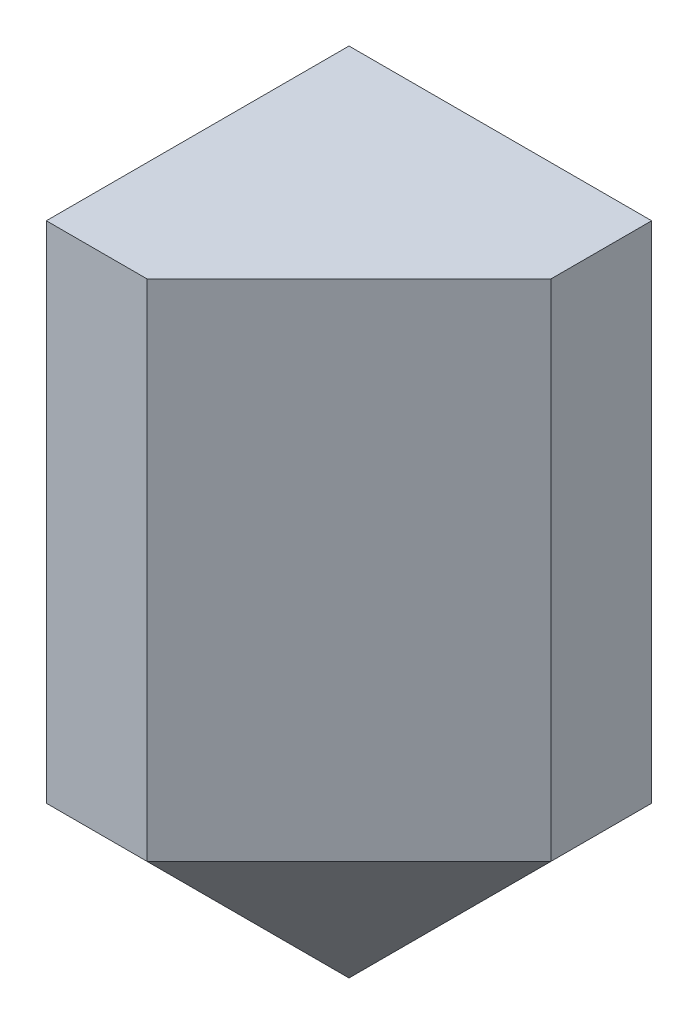
ISO-10303-21;
HEADER;
FILE_DESCRIPTION(('STEP AP214'),'2;1');
FILE_NAME('part.step','',(''),(''),'','','');
FILE_SCHEMA(('AUTOMOTIVE_DESIGN { 1 0 10303 214 1 1 1 1 }'));
ENDSEC;
DATA;
#1=APPLICATION_CONTEXT('core data for automotive mechanical design processes');
#2=APPLICATION_PROTOCOL_DEFINITION('international standard','automotive_design',2000,#1);
#3=PRODUCT_CONTEXT('',#1,'mechanical');
#4=PRODUCT('Part','Part','',(#3));
#5=PRODUCT_RELATED_PRODUCT_CATEGORY('part','',(#4));
#6=PRODUCT_DEFINITION_FORMATION('','',#4);
#7=PRODUCT_DEFINITION_CONTEXT('part definition',#1,'design');
#8=PRODUCT_DEFINITION('design','',#6,#7);
#9=PRODUCT_DEFINITION_SHAPE('','',#8);
#10=(LENGTH_UNIT() NAMED_UNIT(*) SI_UNIT(.MILLI.,.METRE.));
#11=(NAMED_UNIT(*) PLANE_ANGLE_UNIT() SI_UNIT($,.RADIAN.));
#12=(NAMED_UNIT(*) SI_UNIT($,.STERADIAN.) SOLID_ANGLE_UNIT());
#13=UNCERTAINTY_MEASURE_WITH_UNIT(LENGTH_MEASURE(1.E-05),#10,'distance_accuracy_value','');
#14=(GEOMETRIC_REPRESENTATION_CONTEXT(3) GLOBAL_UNCERTAINTY_ASSIGNED_CONTEXT((#13)) GLOBAL_UNIT_ASSIGNED_CONTEXT((#10,
#11,#12)) REPRESENTATION_CONTEXT('',''));
#15=CARTESIAN_POINT('',(0.,0.,0.));
#16=DIRECTION('',(0.,0.,1.));
#17=DIRECTION('',(1.,0.,0.));
#18=AXIS2_PLACEMENT_3D('',#15,#16,#17);
#19=CARTESIAN_POINT('',(0.,0.,30.));
#20=DIRECTION('',(1.,0.,0.));
#21=DIRECTION('',(0.,0.,-1.));
#22=AXIS2_PLACEMENT_3D('',#19,#20,#21);
#23=PLANE('',#22);
#24=CARTESIAN_POINT('',(0.,20.,18.));
#25=DIRECTION('',(-1.,0.,0.));
#26=DIRECTION('',(0.,0.,1.));
#27=AXIS2_PLACEMENT_3D('',#24,#25,#26);
#28=CIRCLE('',#27,2.75);
#29=CARTESIAN_POINT('',(0.,20.,20.75));
#30=VERTEX_POINT('',#29);
#31=EDGE_CURVE('E112',#30,#30,#28,.T.);
#32=ORIENTED_EDGE('',*,*,#31,.F.);
#33=EDGE_LOOP('',(#32));
#34=FACE_BOUND('',#33,.T.);
#35=CARTESIAN_POINT('',(0.,48.,18.));
#36=DIRECTION('',(-1.,0.,0.));
#37=DIRECTION('',(0.,0.,1.));
#38=AXIS2_PLACEMENT_3D('',#35,#36,#37);
#39=CIRCLE('',#38,2.75);
#40=CARTESIAN_POINT('',(0.,48.,20.75));
#41=VERTEX_POINT('',#40);
#42=EDGE_CURVE('E125',#41,#41,#39,.T.);
#43=ORIENTED_EDGE('',*,*,#42,.F.);
#44=EDGE_LOOP('',(#43));
#45=FACE_BOUND('',#44,.T.);
#46=DIRECTION('',(0.,0.,-1.));
#47=VECTOR('',#46,1.);
#48=CARTESIAN_POINT('',(0.,0.,30.));
#49=LINE('',#48,#47);
#50=CARTESIAN_POINT('',(0.,0.,9.99999999999995));
#51=VERTEX_POINT('',#50);
#52=CARTESIAN_POINT('',(0.,0.,0.));
#53=VERTEX_POINT('',#52);
#54=EDGE_CURVE('E150',#51,#53,#49,.T.);
#55=ORIENTED_EDGE('',*,*,#54,.F.);
#56=DIRECTION('',(0.,-0.707106781186546,-0.707106781186549));
#57=VECTOR('',#56,1.);
#58=CARTESIAN_POINT('',(0.,20.,30.));
#59=LINE('',#58,#57);
#60=CARTESIAN_POINT('',(0.,20.,30.));
#61=VERTEX_POINT('',#60);
#62=EDGE_CURVE('E11',#51,#61,#59,.F.);
#63=ORIENTED_EDGE('',*,*,#62,.T.);
#64=DIRECTION('',(0.,-1.,0.));
#65=VECTOR('',#64,1.);
#66=CARTESIAN_POINT('',(0.,0.,30.));
#67=LINE('',#66,#65);
#68=CARTESIAN_POINT('',(0.,70.,30.));
#69=VERTEX_POINT('',#68);
#70=EDGE_CURVE('E147',#69,#61,#67,.T.);
#71=ORIENTED_EDGE('',*,*,#70,.F.);
#72=DIRECTION('',(0.,0.,1.));
#73=VECTOR('',#72,1.);
#74=CARTESIAN_POINT('',(0.,70.,30.));
#75=LINE('',#74,#73);
#76=CARTESIAN_POINT('',(0.,70.,0.));
#77=VERTEX_POINT('',#76);
#78=EDGE_CURVE('E131',#77,#69,#75,.T.);
#79=ORIENTED_EDGE('',*,*,#78,.F.);
#80=DIRECTION('',(0.,-1.,0.));
#81=VECTOR('',#80,1.);
#82=CARTESIAN_POINT('',(0.,0.,0.));
#83=LINE('',#82,#81);
#84=EDGE_CURVE('E152',#77,#53,#83,.T.);
#85=ORIENTED_EDGE('',*,*,#84,.T.);
#86=EDGE_LOOP('',(#55,#63,#71,#79,#85));
#87=FACE_BOUND('',#86,.T.);
#88=ADVANCED_FACE('F39',(#34,#45,#87),#23,.F.);
#89=CARTESIAN_POINT('',(0.,0.,30.));
#90=DIRECTION('',(0.,1.,0.));
#91=DIRECTION('',(0.,0.,1.));
#92=AXIS2_PLACEMENT_3D('',#89,#90,#91);
#93=PLANE('',#92);
#94=DIRECTION('',(1.,0.,0.));
#95=VECTOR('',#94,1.);
#96=CARTESIAN_POINT('',(0.,0.,0.));
#97=LINE('',#96,#95);
#98=CARTESIAN_POINT('',(9.99999999999995,0.,0.));
#99=VERTEX_POINT('',#98);
#100=EDGE_CURVE('E155',#53,#99,#97,.T.);
#101=ORIENTED_EDGE('',*,*,#100,.T.);
#102=DIRECTION('',(0.,0.,1.));
#103=VECTOR('',#102,1.);
#104=CARTESIAN_POINT('',(9.99999999999995,0.,30.));
#105=LINE('',#104,#103);
#106=CARTESIAN_POINT('',(9.99999999999995,0.,9.99999999999995));
#107=VERTEX_POINT('',#106);
#108=EDGE_CURVE('E49',#99,#107,#105,.T.);
#109=ORIENTED_EDGE('',*,*,#108,.T.);
#110=DIRECTION('',(-1.,0.,0.));
#111=VECTOR('',#110,1.);
#112=CARTESIAN_POINT('',(0.,0.,9.99999999999995));
#113=LINE('',#112,#111);
#114=EDGE_CURVE('E60',#107,#51,#113,.T.);
#115=ORIENTED_EDGE('',*,*,#114,.T.);
#116=ORIENTED_EDGE('',*,*,#54,.T.);
#117=EDGE_LOOP('',(#101,#109,#115,#116));
#118=FACE_BOUND('',#117,.T.);
#119=ADVANCED_FACE('F208',(#118),#93,.F.);
#120=CARTESIAN_POINT('',(30.,0.,30.));
#121=DIRECTION('',(-1.,0.,0.));
#122=DIRECTION('',(0.,0.,1.));
#123=AXIS2_PLACEMENT_3D('',#120,#121,#122);
#124=PLANE('',#123);
#125=DIRECTION('',(0.,1.,0.));
#126=VECTOR('',#125,1.);
#127=CARTESIAN_POINT('',(30.,0.,0.));
#128=LINE('',#127,#126);
#129=CARTESIAN_POINT('',(30.,20.,0.));
#130=VERTEX_POINT('',#129);
#131=CARTESIAN_POINT('',(30.,70.,0.));
#132=VERTEX_POINT('',#131);
#133=EDGE_CURVE('E151',#130,#132,#128,.T.);
#134=ORIENTED_EDGE('',*,*,#133,.T.);
#135=DIRECTION('',(0.,0.,-1.));
#136=VECTOR('',#135,1.);
#137=CARTESIAN_POINT('',(30.,70.,0.));
#138=LINE('',#137,#136);
#139=CARTESIAN_POINT('',(30.,70.,9.99999999999992));
#140=VERTEX_POINT('',#139);
#141=EDGE_CURVE('E140',#140,#132,#138,.T.);
#142=ORIENTED_EDGE('',*,*,#141,.F.);
#143=DIRECTION('',(0.,-1.,0.));
#144=VECTOR('',#143,1.);
#145=CARTESIAN_POINT('',(30.,0.,9.99999999999995));
#146=LINE('',#145,#144);
#147=CARTESIAN_POINT('',(30.,20.,9.99999999999995));
#148=VERTEX_POINT('',#147);
#149=EDGE_CURVE('E165',#140,#148,#146,.T.);
#150=ORIENTED_EDGE('',*,*,#149,.T.);
#151=DIRECTION('',(0.,0.,-1.));
#152=VECTOR('',#151,1.);
#153=CARTESIAN_POINT('',(30.,20.,30.));
#154=LINE('',#153,#152);
#155=EDGE_CURVE('E163',#148,#130,#154,.T.);
#156=ORIENTED_EDGE('',*,*,#155,.T.);
#157=EDGE_LOOP('',(#134,#142,#150,#156));
#158=FACE_BOUND('',#157,.T.);
#159=ADVANCED_FACE('F214',(#158),#124,.F.);
#160=CARTESIAN_POINT('',(0.,0.,30.));
#161=DIRECTION('',(0.,0.,-1.));
#162=DIRECTION('',(-1.,0.,0.));
#163=AXIS2_PLACEMENT_3D('',#160,#161,#162);
#164=PLANE('',#163);
#165=DIRECTION('',(1.,0.,0.));
#166=VECTOR('',#165,1.);
#167=CARTESIAN_POINT('',(0.,20.,30.));
#168=LINE('',#167,#166);
#169=CARTESIAN_POINT('',(10.,20.,30.));
#170=VERTEX_POINT('',#169);
#171=EDGE_CURVE('E159',#61,#170,#168,.T.);
#172=ORIENTED_EDGE('',*,*,#171,.T.);
#173=DIRECTION('',(0.,1.,0.));
#174=VECTOR('',#173,1.);
#175=CARTESIAN_POINT('',(10.,0.,30.));
#176=LINE('',#175,#174);
#177=CARTESIAN_POINT('',(9.99999999999999,70.,30.));
#178=VERTEX_POINT('',#177);
#179=EDGE_CURVE('E161',#170,#178,#176,.T.);
#180=ORIENTED_EDGE('',*,*,#179,.T.);
#181=DIRECTION('',(1.,0.,0.));
#182=VECTOR('',#181,1.);
#183=CARTESIAN_POINT('',(9.99999999999999,70.,30.));
#184=LINE('',#183,#182);
#185=EDGE_CURVE('E134',#69,#178,#184,.T.);
#186=ORIENTED_EDGE('',*,*,#185,.F.);
#187=ORIENTED_EDGE('',*,*,#70,.T.);
#188=EDGE_LOOP('',(#172,#180,#186,#187));
#189=FACE_BOUND('',#188,.T.);
#190=ADVANCED_FACE('F188',(#189),#164,.F.);
#191=CARTESIAN_POINT('',(0.,0.,0.));
#192=DIRECTION('',(0.,0.,-1.));
#193=DIRECTION('',(-1.,0.,0.));
#194=AXIS2_PLACEMENT_3D('',#191,#192,#193);
#195=PLANE('',#194);
#196=CARTESIAN_POINT('',(15.,55.,0.));
#197=DIRECTION('',(0.,0.,-1.));
#198=DIRECTION('',(-1.,0.,0.));
#199=AXIS2_PLACEMENT_3D('',#196,#197,#198);
#200=CIRCLE('',#199,10.);
#201=CARTESIAN_POINT('',(5.,55.,0.));
#202=VERTEX_POINT('',#201);
#203=EDGE_CURVE('E425',#202,#202,#200,.T.);
#204=ORIENTED_EDGE('',*,*,#203,.F.);
#205=EDGE_LOOP('',(#204));
#206=FACE_BOUND('',#205,.T.);
#207=CARTESIAN_POINT('',(18.,20.,0.));
#208=DIRECTION('',(0.,0.,-1.));
#209=DIRECTION('',(-1.,0.,0.));
#210=AXIS2_PLACEMENT_3D('',#207,#208,#209);
#211=CIRCLE('',#210,2.74999999999999);
#212=CARTESIAN_POINT('',(15.25,20.,0.));
#213=VERTEX_POINT('',#212);
#214=EDGE_CURVE('E113',#213,#213,#211,.T.);
#215=ORIENTED_EDGE('',*,*,#214,.F.);
#216=EDGE_LOOP('',(#215));
#217=FACE_BOUND('',#216,.T.);
#218=ORIENTED_EDGE('',*,*,#133,.F.);
#219=DIRECTION('',(0.707106781186549,0.707106781186546,0.));
#220=VECTOR('',#219,1.);
#221=CARTESIAN_POINT('',(4.99999999999996,-4.99999999999997,0.));
#222=LINE('',#221,#220);
#223=EDGE_CURVE('E167',#130,#99,#222,.F.);
#224=ORIENTED_EDGE('',*,*,#223,.T.);
#225=ORIENTED_EDGE('',*,*,#100,.F.);
#226=ORIENTED_EDGE('',*,*,#84,.F.);
#227=DIRECTION('',(-1.,0.,0.));
#228=VECTOR('',#227,1.);
#229=CARTESIAN_POINT('',(0.,70.,0.));
#230=LINE('',#229,#228);
#231=EDGE_CURVE('E143',#132,#77,#230,.T.);
#232=ORIENTED_EDGE('',*,*,#231,.F.);
#233=EDGE_LOOP('',(#218,#224,#225,#226,#232));
#234=FACE_BOUND('',#233,.T.);
#235=ADVANCED_FACE('F205',(#206,#217,#234),#195,.T.);
#236=CARTESIAN_POINT('',(30.,20.,30.));
#237=DIRECTION('',(-0.707106781186546,0.707106781186549,0.));
#238=DIRECTION('',(0.,0.,-1.));
#239=AXIS2_PLACEMENT_3D('',#236,#237,#238);
#240=PLANE('',#239);
#241=ORIENTED_EDGE('',*,*,#223,.F.);
#242=ORIENTED_EDGE('',*,*,#155,.F.);
#243=DIRECTION('',(-0.707106781186549,-0.707106781186546,0.));
#244=VECTOR('',#243,1.);
#245=CARTESIAN_POINT('',(30.,20.,9.99999999999995));
#246=LINE('',#245,#244);
#247=EDGE_CURVE('E44',#107,#148,#246,.F.);
#248=ORIENTED_EDGE('',*,*,#247,.F.);
#249=ORIENTED_EDGE('',*,*,#108,.F.);
#250=EDGE_LOOP('',(#241,#242,#248,#249));
#251=FACE_BOUND('',#250,.T.);
#252=ADVANCED_FACE('F42',(#251),#240,.F.);
#253=CARTESIAN_POINT('',(0.,20.,30.));
#254=DIRECTION('',(0.,0.707106781186549,-0.707106781186546));
#255=DIRECTION('',(1.,0.,0.));
#256=AXIS2_PLACEMENT_3D('',#253,#254,#255);
#257=PLANE('',#256);
#258=ORIENTED_EDGE('',*,*,#62,.F.);
#259=ORIENTED_EDGE('',*,*,#114,.F.);
#260=DIRECTION('',(0.,0.707106781186546,0.707106781186549));
#261=VECTOR('',#260,1.);
#262=CARTESIAN_POINT('',(9.99999999999998,10.,20.));
#263=LINE('',#262,#261);
#264=EDGE_CURVE('E172',#170,#107,#263,.F.);
#265=ORIENTED_EDGE('',*,*,#264,.F.);
#266=ORIENTED_EDGE('',*,*,#171,.F.);
#267=EDGE_LOOP('',(#258,#259,#265,#266));
#268=FACE_BOUND('',#267,.T.);
#269=ADVANCED_FACE('F198',(#268),#257,.F.);
#270=CARTESIAN_POINT('',(30.,20.,9.99999999999995));
#271=DIRECTION('',(0.577350269189626,-0.577350269189628,0.577350269189624));
#272=DIRECTION('',(0.707106781186549,0.707106781186546,0.));
#273=AXIS2_PLACEMENT_3D('',#270,#271,#272);
#274=PLANE('',#273);
#275=ORIENTED_EDGE('',*,*,#264,.T.);
#276=ORIENTED_EDGE('',*,*,#247,.T.);
#277=DIRECTION('',(0.707106781186546,0.,-0.707106781186549));
#278=VECTOR('',#277,1.);
#279=CARTESIAN_POINT('',(30.,20.,9.99999999999995));
#280=LINE('',#279,#278);
#281=EDGE_CURVE('E146',#170,#148,#280,.T.);
#282=ORIENTED_EDGE('',*,*,#281,.F.);
#283=EDGE_LOOP('',(#275,#276,#282));
#284=FACE_BOUND('',#283,.T.);
#285=ADVANCED_FACE('F179',(#284),#274,.T.);
#286=CARTESIAN_POINT('',(10.,0.,30.));
#287=DIRECTION('',(-0.707106781186549,0.,-0.707106781186546));
#288=DIRECTION('',(0.,1.,0.));
#289=AXIS2_PLACEMENT_3D('',#286,#287,#288);
#290=PLANE('',#289);
#291=ORIENTED_EDGE('',*,*,#281,.T.);
#292=ORIENTED_EDGE('',*,*,#149,.F.);
#293=DIRECTION('',(0.707106781186546,0.,-0.707106781186549));
#294=VECTOR('',#293,1.);
#295=CARTESIAN_POINT('',(30.,70.,9.99999999999992));
#296=LINE('',#295,#294);
#297=EDGE_CURVE('E137',#178,#140,#296,.T.);
#298=ORIENTED_EDGE('',*,*,#297,.F.);
#299=ORIENTED_EDGE('',*,*,#179,.F.);
#300=EDGE_LOOP('',(#291,#292,#298,#299));
#301=FACE_BOUND('',#300,.T.);
#302=ADVANCED_FACE('F184',(#301),#290,.F.);
#303=CARTESIAN_POINT('',(0.,70.,0.));
#304=DIRECTION('',(0.,-1.,0.));
#305=DIRECTION('',(0.,0.,-1.));
#306=AXIS2_PLACEMENT_3D('',#303,#304,#305);
#307=PLANE('',#306);
#308=ORIENTED_EDGE('',*,*,#78,.T.);
#309=ORIENTED_EDGE('',*,*,#185,.T.);
#310=ORIENTED_EDGE('',*,*,#297,.T.);
#311=ORIENTED_EDGE('',*,*,#141,.T.);
#312=ORIENTED_EDGE('',*,*,#231,.T.);
#313=EDGE_LOOP('',(#308,#309,#310,#311,#312));
#314=FACE_BOUND('',#313,.T.);
#315=ADVANCED_FACE('F191',(#314),#307,.F.);
#316=CARTESIAN_POINT('',(15.,48.,18.));
#317=DIRECTION('',(-1.,0.,0.));
#318=DIRECTION('',(0.,0.,1.));
#319=AXIS2_PLACEMENT_3D('',#316,#317,#318);
#320=CONICAL_SURFACE('',#319,2.75,1.02974425867665);
#321=CARTESIAN_POINT('',(16.6523667023258,48.,18.));
#322=VERTEX_POINT('',#321);
#323=VERTEX_LOOP('',#322);
#324=FACE_BOUND('',#323,.T.);
#325=CARTESIAN_POINT('',(15.,48.,18.));
#326=DIRECTION('',(-1.,0.,0.));
#327=DIRECTION('',(0.,0.,1.));
#328=AXIS2_PLACEMENT_3D('',#325,#326,#327);
#329=CIRCLE('',#328,2.75);
#330=CARTESIAN_POINT('',(15.,48.,20.75));
#331=VERTEX_POINT('',#330);
#332=EDGE_CURVE('E128',#331,#331,#329,.T.);
#333=ORIENTED_EDGE('',*,*,#332,.T.);
#334=EDGE_LOOP('',(#333));
#335=FACE_BOUND('',#334,.T.);
#336=ADVANCED_FACE('F234',(#324,#335),#320,.F.);
#337=CARTESIAN_POINT('',(0.,48.,18.));
#338=DIRECTION('',(-1.,0.,0.));
#339=DIRECTION('',(0.,0.,1.));
#340=AXIS2_PLACEMENT_3D('',#337,#338,#339);
#341=CYLINDRICAL_SURFACE('',#340,2.75);
#342=ORIENTED_EDGE('',*,*,#332,.F.);
#343=EDGE_LOOP('',(#342));
#344=FACE_BOUND('',#343,.T.);
#345=ORIENTED_EDGE('',*,*,#42,.T.);
#346=EDGE_LOOP('',(#345));
#347=FACE_BOUND('',#346,.T.);
#348=ADVANCED_FACE('F239',(#344,#347),#341,.F.);
#349=CARTESIAN_POINT('',(15.,20.,18.));
#350=DIRECTION('',(-1.,0.,0.));
#351=DIRECTION('',(0.,0.,1.));
#352=AXIS2_PLACEMENT_3D('',#349,#350,#351);
#353=CONICAL_SURFACE('',#352,2.74999999999999,1.02974425867665);
#354=CARTESIAN_POINT('',(16.6523667023258,20.,18.));
#355=VERTEX_POINT('',#354);
#356=VERTEX_LOOP('',#355);
#357=FACE_BOUND('',#356,.T.);
#358=CARTESIAN_POINT('',(15.,20.,18.));
#359=DIRECTION('',(-1.,0.,0.));
#360=DIRECTION('',(0.,0.,1.));
#361=AXIS2_PLACEMENT_3D('',#358,#359,#360);
#362=CIRCLE('',#361,2.74999999999999);
#363=CARTESIAN_POINT('',(15.,20.,20.75));
#364=VERTEX_POINT('',#363);
#365=EDGE_CURVE('E116',#364,#364,#362,.T.);
#366=ORIENTED_EDGE('',*,*,#365,.T.);
#367=EDGE_LOOP('',(#366));
#368=FACE_BOUND('',#367,.T.);
#369=ADVANCED_FACE('F351',(#357,#368),#353,.F.);
#370=CARTESIAN_POINT('',(0.,20.,18.));
#371=DIRECTION('',(-1.,0.,0.));
#372=DIRECTION('',(0.,0.,1.));
#373=AXIS2_PLACEMENT_3D('',#370,#371,#372);
#374=CYLINDRICAL_SURFACE('',#373,2.74999999999999);
#375=ORIENTED_EDGE('',*,*,#365,.F.);
#376=EDGE_LOOP('',(#375));
#377=FACE_BOUND('',#376,.T.);
#378=ORIENTED_EDGE('',*,*,#31,.T.);
#379=EDGE_LOOP('',(#378));
#380=FACE_BOUND('',#379,.T.);
#381=ADVANCED_FACE('F106',(#377,#380),#374,.F.);
#382=CARTESIAN_POINT('',(18.,20.,15.));
#383=DIRECTION('',(0.,0.,-1.));
#384=DIRECTION('',(-1.,0.,0.));
#385=AXIS2_PLACEMENT_3D('',#382,#383,#384);
#386=CONICAL_SURFACE('',#385,2.74999999999999,1.02974425867665);
#387=CARTESIAN_POINT('',(18.,20.,16.6523667023258));
#388=VERTEX_POINT('',#387);
#389=VERTEX_LOOP('',#388);
#390=FACE_BOUND('',#389,.T.);
#391=CARTESIAN_POINT('',(18.,20.,15.));
#392=DIRECTION('',(0.,0.,-1.));
#393=DIRECTION('',(-1.,0.,0.));
#394=AXIS2_PLACEMENT_3D('',#391,#392,#393);
#395=CIRCLE('',#394,2.74999999999999);
#396=CARTESIAN_POINT('',(15.25,20.,15.));
#397=VERTEX_POINT('',#396);
#398=EDGE_CURVE('E110',#397,#397,#395,.T.);
#399=ORIENTED_EDGE('',*,*,#398,.T.);
#400=EDGE_LOOP('',(#399));
#401=FACE_BOUND('',#400,.T.);
#402=ADVANCED_FACE('F102',(#390,#401),#386,.F.);
#403=CARTESIAN_POINT('',(18.,20.,0.));
#404=DIRECTION('',(0.,0.,-1.));
#405=DIRECTION('',(-1.,0.,0.));
#406=AXIS2_PLACEMENT_3D('',#403,#404,#405);
#407=CYLINDRICAL_SURFACE('',#406,2.74999999999999);
#408=ORIENTED_EDGE('',*,*,#398,.F.);
#409=EDGE_LOOP('',(#408));
#410=FACE_BOUND('',#409,.T.);
#411=ORIENTED_EDGE('',*,*,#214,.T.);
#412=EDGE_LOOP('',(#411));
#413=FACE_BOUND('',#412,.T.);
#414=ADVANCED_FACE('F105',(#410,#413),#407,.F.);
#415=CARTESIAN_POINT('',(15.,55.,2.));
#416=DIRECTION('',(0.,0.,-1.));
#417=DIRECTION('',(-1.,0.,0.));
#418=AXIS2_PLACEMENT_3D('',#415,#416,#417);
#419=CYLINDRICAL_SURFACE('',#418,10.);
#420=CARTESIAN_POINT('',(15.,55.,2.));
#421=DIRECTION('',(0.,0.,-1.));
#422=DIRECTION('',(-1.,0.,0.));
#423=AXIS2_PLACEMENT_3D('',#420,#421,#422);
#424=CIRCLE('',#423,10.);
#425=CARTESIAN_POINT('',(5.,55.,2.));
#426=VERTEX_POINT('',#425);
#427=EDGE_CURVE('E119',#426,#426,#424,.T.);
#428=ORIENTED_EDGE('',*,*,#427,.F.);
#429=EDGE_LOOP('',(#428));
#430=FACE_BOUND('',#429,.T.);
#431=ORIENTED_EDGE('',*,*,#203,.T.);
#432=EDGE_LOOP('',(#431));
#433=FACE_BOUND('',#432,.T.);
#434=ADVANCED_FACE('F386',(#430,#433),#419,.F.);
#435=CARTESIAN_POINT('',(15.,55.,2.));
#436=DIRECTION('',(0.,0.,-1.));
#437=DIRECTION('',(-1.,0.,0.));
#438=AXIS2_PLACEMENT_3D('',#435,#436,#437);
#439=PLANE('',#438);
#440=ORIENTED_EDGE('',*,*,#427,.T.);
#441=EDGE_LOOP('',(#440));
#442=FACE_BOUND('',#441,.T.);
#443=ADVANCED_FACE('F396',(#442),#439,.T.);
#444=CLOSED_SHELL('',(#88,#119,#159,#190,#235,#252,#269,#285,#302,#315,#336,#348,#369,#381,#402,
#414,#434,#443));
#445=MANIFOLD_SOLID_BREP('B2',#444);
#446=ADVANCED_BREP_SHAPE_REPRESENTATION('',(#18,#445),#14);
#447=SHAPE_DEFINITION_REPRESENTATION(#9,#446);
ENDSEC;
END-ISO-10303-21;
